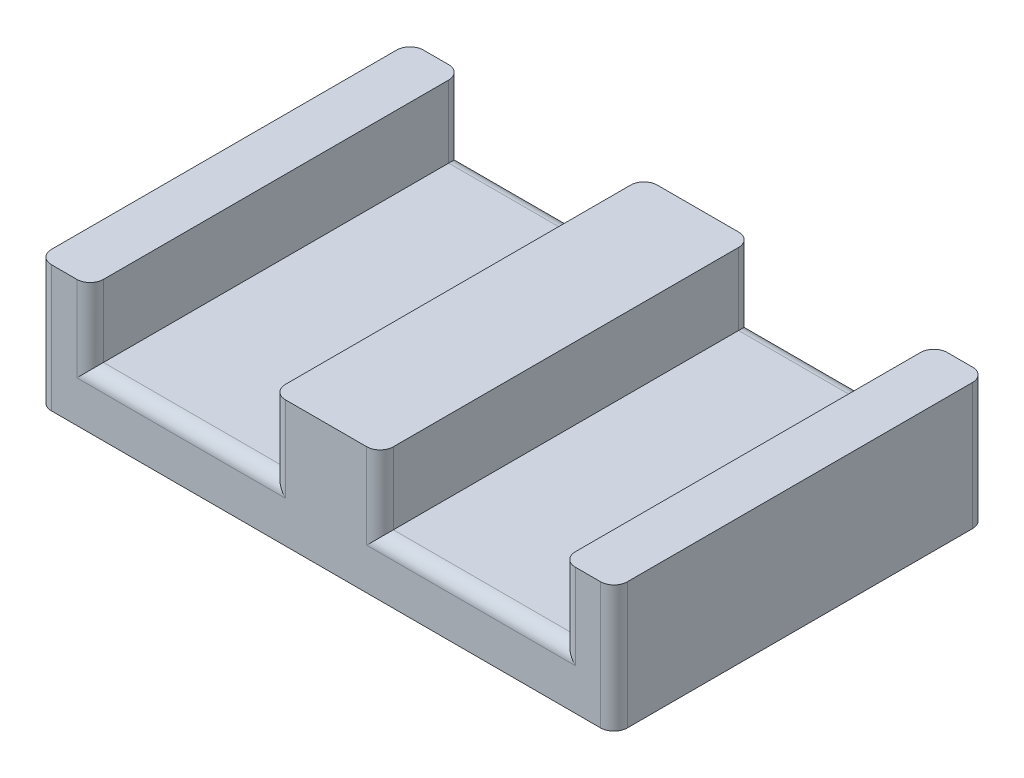
ISO-10303-21;
HEADER;
FILE_DESCRIPTION(('STEP AP214'),'2;1');
FILE_NAME('part.step','',(''),(''),'','','');
FILE_SCHEMA(('AUTOMOTIVE_DESIGN { 1 0 10303 214 1 1 1 1 }'));
ENDSEC;
DATA;
#1=APPLICATION_CONTEXT('core data for automotive mechanical design processes');
#2=APPLICATION_PROTOCOL_DEFINITION('international standard','automotive_design',2000,#1);
#3=PRODUCT_CONTEXT('',#1,'mechanical');
#4=PRODUCT('Part','Part','',(#3));
#5=PRODUCT_RELATED_PRODUCT_CATEGORY('part','',(#4));
#6=PRODUCT_DEFINITION_FORMATION('','',#4);
#7=PRODUCT_DEFINITION_CONTEXT('part definition',#1,'design');
#8=PRODUCT_DEFINITION('design','',#6,#7);
#9=PRODUCT_DEFINITION_SHAPE('','',#8);
#10=(LENGTH_UNIT() NAMED_UNIT(*) SI_UNIT(.MILLI.,.METRE.));
#11=(NAMED_UNIT(*) PLANE_ANGLE_UNIT() SI_UNIT($,.RADIAN.));
#12=(NAMED_UNIT(*) SI_UNIT($,.STERADIAN.) SOLID_ANGLE_UNIT());
#13=UNCERTAINTY_MEASURE_WITH_UNIT(LENGTH_MEASURE(1.E-05),#10,'distance_accuracy_value','');
#14=(GEOMETRIC_REPRESENTATION_CONTEXT(3) GLOBAL_UNCERTAINTY_ASSIGNED_CONTEXT((#13)) GLOBAL_UNIT_ASSIGNED_CONTEXT((#10,
#11,#12)) REPRESENTATION_CONTEXT('',''));
#15=CARTESIAN_POINT('',(0.,0.,0.));
#16=DIRECTION('',(0.,0.,1.));
#17=DIRECTION('',(1.,0.,0.));
#18=AXIS2_PLACEMENT_3D('',#15,#16,#17);
#19=CARTESIAN_POINT('',(0.,4.1,0.));
#20=DIRECTION('',(0.,-1.,0.));
#21=DIRECTION('',(0.,0.,-1.));
#22=AXIS2_PLACEMENT_3D('',#19,#20,#21);
#23=PLANE('',#22);
#24=DIRECTION('',(0.,0.,1.));
#25=VECTOR('',#24,1.);
#26=CARTESIAN_POINT('',(17.7,4.1,13.95));
#27=LINE('',#26,#25);
#28=CARTESIAN_POINT('',(17.7,4.1,-12.95));
#29=VERTEX_POINT('',#28);
#30=CARTESIAN_POINT('',(17.7,4.1,12.95));
#31=VERTEX_POINT('',#30);
#32=EDGE_CURVE('E328',#29,#31,#27,.T.);
#33=ORIENTED_EDGE('',*,*,#32,.F.);
#34=DIRECTION('',(-1.,0.,0.));
#35=VECTOR('',#34,1.);
#36=CARTESIAN_POINT('',(0.,4.1,-12.95));
#37=LINE('',#36,#35);
#38=CARTESIAN_POINT('',(4.05,4.1,-12.95));
#39=VERTEX_POINT('',#38);
#40=EDGE_CURVE('E295',#29,#39,#37,.T.);
#41=ORIENTED_EDGE('',*,*,#40,.T.);
#42=DIRECTION('',(0.,0.,-1.));
#43=VECTOR('',#42,1.);
#44=CARTESIAN_POINT('',(4.05,4.1,-13.95));
#45=LINE('',#44,#43);
#46=CARTESIAN_POINT('',(4.05,4.1,12.95));
#47=VERTEX_POINT('',#46);
#48=EDGE_CURVE('E368',#47,#39,#45,.T.);
#49=ORIENTED_EDGE('',*,*,#48,.F.);
#50=DIRECTION('',(1.,0.,0.));
#51=VECTOR('',#50,1.);
#52=CARTESIAN_POINT('',(0.,4.1,12.95));
#53=LINE('',#52,#51);
#54=EDGE_CURVE('E293',#47,#31,#53,.T.);
#55=ORIENTED_EDGE('',*,*,#54,.T.);
#56=EDGE_LOOP('',(#33,#41,#49,#55));
#57=FACE_BOUND('',#56,.T.);
#58=ADVANCED_FACE('F37',(#57),#23,.F.);
#59=DIRECTION('',(0.,0.,1.));
#60=VECTOR('',#59,1.);
#61=CARTESIAN_POINT('',(-4.05,4.1,-13.95));
#62=LINE('',#61,#60);
#63=CARTESIAN_POINT('',(-4.05,4.1,-12.95));
#64=VERTEX_POINT('',#63);
#65=CARTESIAN_POINT('',(-4.05,4.1,12.95));
#66=VERTEX_POINT('',#65);
#67=EDGE_CURVE('E375',#64,#66,#62,.T.);
#68=ORIENTED_EDGE('',*,*,#67,.F.);
#69=DIRECTION('',(-1.,0.,0.));
#70=VECTOR('',#69,1.);
#71=CARTESIAN_POINT('',(0.,4.1,-12.95));
#72=LINE('',#71,#70);
#73=CARTESIAN_POINT('',(-17.7,4.1,-12.95));
#74=VERTEX_POINT('',#73);
#75=EDGE_CURVE('E300',#64,#74,#72,.T.);
#76=ORIENTED_EDGE('',*,*,#75,.T.);
#77=DIRECTION('',(0.,0.,-1.));
#78=VECTOR('',#77,1.);
#79=CARTESIAN_POINT('',(-17.7,4.1,13.95));
#80=LINE('',#79,#78);
#81=CARTESIAN_POINT('',(-17.7,4.1,12.95));
#82=VERTEX_POINT('',#81);
#83=EDGE_CURVE('E362',#82,#74,#80,.T.);
#84=ORIENTED_EDGE('',*,*,#83,.F.);
#85=DIRECTION('',(1.,0.,0.));
#86=VECTOR('',#85,1.);
#87=CARTESIAN_POINT('',(0.,4.1,12.95));
#88=LINE('',#87,#86);
#89=EDGE_CURVE('E298',#82,#66,#88,.T.);
#90=ORIENTED_EDGE('',*,*,#89,.T.);
#91=EDGE_LOOP('',(#68,#76,#84,#90));
#92=FACE_BOUND('',#91,.T.);
#93=ADVANCED_FACE('F413',(#92),#23,.F.);
#94=CARTESIAN_POINT('',(21.6,4.1,13.95));
#95=DIRECTION('',(-1.,0.,0.));
#96=DIRECTION('',(0.,0.,1.));
#97=AXIS2_PLACEMENT_3D('',#94,#95,#96);
#98=PLANE('',#97);
#99=DIRECTION('',(0.,0.,-1.));
#100=VECTOR('',#99,1.);
#101=CARTESIAN_POINT('',(21.6,9.5,13.95));
#102=LINE('',#101,#100);
#103=CARTESIAN_POINT('',(21.6,9.5,12.95));
#104=VERTEX_POINT('',#103);
#105=CARTESIAN_POINT('',(21.6,9.5,-12.95));
#106=VERTEX_POINT('',#105);
#107=EDGE_CURVE('E468',#104,#106,#102,.T.);
#108=ORIENTED_EDGE('',*,*,#107,.F.);
#109=DIRECTION('',(0.,-1.,0.));
#110=VECTOR('',#109,1.);
#111=CARTESIAN_POINT('',(21.6,4.1,12.95));
#112=LINE('',#111,#110);
#113=CARTESIAN_POINT('',(21.6,0.,12.95));
#114=VERTEX_POINT('',#113);
#115=EDGE_CURVE('E282',#104,#114,#112,.T.);
#116=ORIENTED_EDGE('',*,*,#115,.T.);
#117=DIRECTION('',(0.,0.,-1.));
#118=VECTOR('',#117,1.);
#119=CARTESIAN_POINT('',(21.6,0.,13.95));
#120=LINE('',#119,#118);
#121=CARTESIAN_POINT('',(21.6,0.,-12.95));
#122=VERTEX_POINT('',#121);
#123=EDGE_CURVE('E383',#114,#122,#120,.T.);
#124=ORIENTED_EDGE('',*,*,#123,.T.);
#125=DIRECTION('',(0.,-1.,0.));
#126=VECTOR('',#125,1.);
#127=CARTESIAN_POINT('',(21.6,4.1,-12.95));
#128=LINE('',#127,#126);
#129=EDGE_CURVE('E280',#122,#106,#128,.F.);
#130=ORIENTED_EDGE('',*,*,#129,.T.);
#131=EDGE_LOOP('',(#108,#116,#124,#130));
#132=FACE_BOUND('',#131,.T.);
#133=ADVANCED_FACE('F410',(#132),#98,.F.);
#134=CARTESIAN_POINT('',(-21.6,4.1,-13.95));
#135=DIRECTION('',(0.,0.,1.));
#136=DIRECTION('',(1.,0.,0.));
#137=AXIS2_PLACEMENT_3D('',#134,#135,#136);
#138=PLANE('',#137);
#139=DIRECTION('',(-1.,0.,0.));
#140=VECTOR('',#139,1.);
#141=CARTESIAN_POINT('',(-21.6,0.,-13.95));
#142=LINE('',#141,#140);
#143=CARTESIAN_POINT('',(20.6,0.,-13.95));
#144=VERTEX_POINT('',#143);
#145=CARTESIAN_POINT('',(-20.6,0.,-13.95));
#146=VERTEX_POINT('',#145);
#147=EDGE_CURVE('E233',#144,#146,#142,.T.);
#148=ORIENTED_EDGE('',*,*,#147,.T.);
#149=DIRECTION('',(0.,-1.,0.));
#150=VECTOR('',#149,1.);
#151=CARTESIAN_POINT('',(-20.6,4.1,-13.95));
#152=LINE('',#151,#150);
#153=CARTESIAN_POINT('',(-20.6,9.5,-13.95));
#154=VERTEX_POINT('',#153);
#155=EDGE_CURVE('E278',#146,#154,#152,.F.);
#156=ORIENTED_EDGE('',*,*,#155,.T.);
#157=DIRECTION('',(-1.,0.,0.));
#158=VECTOR('',#157,1.);
#159=CARTESIAN_POINT('',(-21.6,9.5,-13.95));
#160=LINE('',#159,#158);
#161=CARTESIAN_POINT('',(-18.7,9.5,-13.95));
#162=VERTEX_POINT('',#161);
#163=EDGE_CURVE('E360',#162,#154,#160,.T.);
#164=ORIENTED_EDGE('',*,*,#163,.F.);
#165=DIRECTION('',(0.,-1.,0.));
#166=VECTOR('',#165,1.);
#167=CARTESIAN_POINT('',(-18.7,4.1,-13.95));
#168=LINE('',#167,#166);
#169=CARTESIAN_POINT('',(-18.7,3.1,-13.95));
#170=VERTEX_POINT('',#169);
#171=EDGE_CURVE('E273',#162,#170,#168,.T.);
#172=ORIENTED_EDGE('',*,*,#171,.T.);
#173=DIRECTION('',(-1.,0.,0.));
#174=VECTOR('',#173,1.);
#175=CARTESIAN_POINT('',(-21.6,3.1,-13.95));
#176=LINE('',#175,#174);
#177=CARTESIAN_POINT('',(-3.05,3.1,-13.95));
#178=VERTEX_POINT('',#177);
#179=EDGE_CURVE('E271',#170,#178,#176,.F.);
#180=ORIENTED_EDGE('',*,*,#179,.T.);
#181=DIRECTION('',(0.,-1.,0.));
#182=VECTOR('',#181,1.);
#183=CARTESIAN_POINT('',(-3.05,4.1,-13.95));
#184=LINE('',#183,#182);
#185=CARTESIAN_POINT('',(-3.05,9.5,-13.95));
#186=VERTEX_POINT('',#185);
#187=EDGE_CURVE('E269',#178,#186,#184,.F.);
#188=ORIENTED_EDGE('',*,*,#187,.T.);
#189=DIRECTION('',(-1.,0.,0.));
#190=VECTOR('',#189,1.);
#191=CARTESIAN_POINT('',(-4.05,9.5,-13.95));
#192=LINE('',#191,#190);
#193=CARTESIAN_POINT('',(3.05,9.5,-13.95));
#194=VERTEX_POINT('',#193);
#195=EDGE_CURVE('E374',#194,#186,#192,.T.);
#196=ORIENTED_EDGE('',*,*,#195,.F.);
#197=DIRECTION('',(0.,-1.,0.));
#198=VECTOR('',#197,1.);
#199=CARTESIAN_POINT('',(3.05,4.1,-13.95));
#200=LINE('',#199,#198);
#201=CARTESIAN_POINT('',(3.05,3.1,-13.95));
#202=VERTEX_POINT('',#201);
#203=EDGE_CURVE('E267',#194,#202,#200,.T.);
#204=ORIENTED_EDGE('',*,*,#203,.T.);
#205=DIRECTION('',(-1.,0.,0.));
#206=VECTOR('',#205,1.);
#207=CARTESIAN_POINT('',(-21.6,3.1,-13.95));
#208=LINE('',#207,#206);
#209=CARTESIAN_POINT('',(18.7,3.1,-13.95));
#210=VERTEX_POINT('',#209);
#211=EDGE_CURVE('E265',#202,#210,#208,.F.);
#212=ORIENTED_EDGE('',*,*,#211,.T.);
#213=DIRECTION('',(0.,-1.,0.));
#214=VECTOR('',#213,1.);
#215=CARTESIAN_POINT('',(18.7,4.1,-13.95));
#216=LINE('',#215,#214);
#217=CARTESIAN_POINT('',(18.7,9.5,-13.95));
#218=VERTEX_POINT('',#217);
#219=EDGE_CURVE('E263',#210,#218,#216,.F.);
#220=ORIENTED_EDGE('',*,*,#219,.T.);
#221=DIRECTION('',(-1.,0.,0.));
#222=VECTOR('',#221,1.);
#223=CARTESIAN_POINT('',(21.6,9.5,-13.95));
#224=LINE('',#223,#222);
#225=CARTESIAN_POINT('',(20.6,9.5,-13.95));
#226=VERTEX_POINT('',#225);
#227=EDGE_CURVE('E465',#226,#218,#224,.T.);
#228=ORIENTED_EDGE('',*,*,#227,.F.);
#229=DIRECTION('',(0.,-1.,0.));
#230=VECTOR('',#229,1.);
#231=CARTESIAN_POINT('',(20.6,4.1,-13.95));
#232=LINE('',#231,#230);
#233=EDGE_CURVE('E275',#226,#144,#232,.T.);
#234=ORIENTED_EDGE('',*,*,#233,.T.);
#235=EDGE_LOOP('',(#148,#156,#164,#172,#180,#188,#196,#204,#212,#220,#228,#234));
#236=FACE_BOUND('',#235,.T.);
#237=ADVANCED_FACE('F392',(#236),#138,.F.);
#238=CARTESIAN_POINT('',(-21.6,4.1,13.95));
#239=DIRECTION('',(1.,0.,0.));
#240=DIRECTION('',(0.,0.,-1.));
#241=AXIS2_PLACEMENT_3D('',#238,#239,#240);
#242=PLANE('',#241);
#243=DIRECTION('',(0.,0.,1.));
#244=VECTOR('',#243,1.);
#245=CARTESIAN_POINT('',(-21.6,0.,13.95));
#246=LINE('',#245,#244);
#247=CARTESIAN_POINT('',(-21.6,0.,-12.95));
#248=VERTEX_POINT('',#247);
#249=CARTESIAN_POINT('',(-21.6,0.,12.95));
#250=VERTEX_POINT('',#249);
#251=EDGE_CURVE('E229',#248,#250,#246,.T.);
#252=ORIENTED_EDGE('',*,*,#251,.T.);
#253=DIRECTION('',(0.,-1.,0.));
#254=VECTOR('',#253,1.);
#255=CARTESIAN_POINT('',(-21.6,4.1,12.95));
#256=LINE('',#255,#254);
#257=CARTESIAN_POINT('',(-21.6,9.5,12.95));
#258=VERTEX_POINT('',#257);
#259=EDGE_CURVE('E206',#250,#258,#256,.F.);
#260=ORIENTED_EDGE('',*,*,#259,.T.);
#261=DIRECTION('',(0.,0.,1.));
#262=VECTOR('',#261,1.);
#263=CARTESIAN_POINT('',(-21.6,9.5,13.95));
#264=LINE('',#263,#262);
#265=CARTESIAN_POINT('',(-21.6,9.5,-12.95));
#266=VERTEX_POINT('',#265);
#267=EDGE_CURVE('E358',#266,#258,#264,.T.);
#268=ORIENTED_EDGE('',*,*,#267,.F.);
#269=DIRECTION('',(0.,-1.,0.));
#270=VECTOR('',#269,1.);
#271=CARTESIAN_POINT('',(-21.6,4.1,-12.95));
#272=LINE('',#271,#270);
#273=EDGE_CURVE('E211',#266,#248,#272,.T.);
#274=ORIENTED_EDGE('',*,*,#273,.T.);
#275=EDGE_LOOP('',(#252,#260,#268,#274));
#276=FACE_BOUND('',#275,.T.);
#277=ADVANCED_FACE('F402',(#276),#242,.F.);
#278=CARTESIAN_POINT('',(-21.6,4.1,13.95));
#279=DIRECTION('',(0.,0.,-1.));
#280=DIRECTION('',(-1.,0.,0.));
#281=AXIS2_PLACEMENT_3D('',#278,#279,#280);
#282=PLANE('',#281);
#283=DIRECTION('',(1.,0.,0.));
#284=VECTOR('',#283,1.);
#285=CARTESIAN_POINT('',(-21.6,9.5,13.95));
#286=LINE('',#285,#284);
#287=CARTESIAN_POINT('',(-20.6,9.5,13.95));
#288=VERTEX_POINT('',#287);
#289=CARTESIAN_POINT('',(-18.7,9.5,13.95));
#290=VERTEX_POINT('',#289);
#291=EDGE_CURVE('E221',#288,#290,#286,.T.);
#292=ORIENTED_EDGE('',*,*,#291,.F.);
#293=DIRECTION('',(0.,-1.,0.));
#294=VECTOR('',#293,1.);
#295=CARTESIAN_POINT('',(-20.6,4.1,13.95));
#296=LINE('',#295,#294);
#297=CARTESIAN_POINT('',(-20.6,0.,13.95));
#298=VERTEX_POINT('',#297);
#299=EDGE_CURVE('E205',#288,#298,#296,.T.);
#300=ORIENTED_EDGE('',*,*,#299,.T.);
#301=DIRECTION('',(1.,0.,0.));
#302=VECTOR('',#301,1.);
#303=CARTESIAN_POINT('',(-21.6,0.,13.95));
#304=LINE('',#303,#302);
#305=CARTESIAN_POINT('',(20.6,0.,13.95));
#306=VERTEX_POINT('',#305);
#307=EDGE_CURVE('E218',#298,#306,#304,.T.);
#308=ORIENTED_EDGE('',*,*,#307,.T.);
#309=DIRECTION('',(0.,-1.,0.));
#310=VECTOR('',#309,1.);
#311=CARTESIAN_POINT('',(20.6,4.1,13.95));
#312=LINE('',#311,#310);
#313=CARTESIAN_POINT('',(20.6,9.5,13.95));
#314=VERTEX_POINT('',#313);
#315=EDGE_CURVE('E223',#306,#314,#312,.F.);
#316=ORIENTED_EDGE('',*,*,#315,.T.);
#317=DIRECTION('',(1.,0.,0.));
#318=VECTOR('',#317,1.);
#319=CARTESIAN_POINT('',(21.6,9.5,13.95));
#320=LINE('',#319,#318);
#321=CARTESIAN_POINT('',(18.7,9.5,13.95));
#322=VERTEX_POINT('',#321);
#323=EDGE_CURVE('E371',#322,#314,#320,.T.);
#324=ORIENTED_EDGE('',*,*,#323,.F.);
#325=DIRECTION('',(0.,-1.,0.));
#326=VECTOR('',#325,1.);
#327=CARTESIAN_POINT('',(18.7,4.1,13.95));
#328=LINE('',#327,#326);
#329=CARTESIAN_POINT('',(18.7,3.1,13.95));
#330=VERTEX_POINT('',#329);
#331=EDGE_CURVE('E245',#322,#330,#328,.T.);
#332=ORIENTED_EDGE('',*,*,#331,.T.);
#333=DIRECTION('',(1.,0.,0.));
#334=VECTOR('',#333,1.);
#335=CARTESIAN_POINT('',(-21.6,3.1,13.95));
#336=LINE('',#335,#334);
#337=CARTESIAN_POINT('',(3.05,3.1,13.95));
#338=VERTEX_POINT('',#337);
#339=EDGE_CURVE('E243',#330,#338,#336,.F.);
#340=ORIENTED_EDGE('',*,*,#339,.T.);
#341=DIRECTION('',(0.,-1.,0.));
#342=VECTOR('',#341,1.);
#343=CARTESIAN_POINT('',(3.05,4.1,13.95));
#344=LINE('',#343,#342);
#345=CARTESIAN_POINT('',(3.05,9.5,13.95));
#346=VERTEX_POINT('',#345);
#347=EDGE_CURVE('E241',#338,#346,#344,.F.);
#348=ORIENTED_EDGE('',*,*,#347,.T.);
#349=DIRECTION('',(1.,0.,0.));
#350=VECTOR('',#349,1.);
#351=CARTESIAN_POINT('',(-4.05,9.5,13.95));
#352=LINE('',#351,#350);
#353=CARTESIAN_POINT('',(-3.05,9.5,13.95));
#354=VERTEX_POINT('',#353);
#355=EDGE_CURVE('E381',#354,#346,#352,.T.);
#356=ORIENTED_EDGE('',*,*,#355,.F.);
#357=DIRECTION('',(0.,-1.,0.));
#358=VECTOR('',#357,1.);
#359=CARTESIAN_POINT('',(-3.05,4.1,13.95));
#360=LINE('',#359,#358);
#361=CARTESIAN_POINT('',(-3.05,3.1,13.95));
#362=VERTEX_POINT('',#361);
#363=EDGE_CURVE('E238',#354,#362,#360,.T.);
#364=ORIENTED_EDGE('',*,*,#363,.T.);
#365=DIRECTION('',(1.,0.,0.));
#366=VECTOR('',#365,1.);
#367=CARTESIAN_POINT('',(-21.6,3.1,13.95));
#368=LINE('',#367,#366);
#369=CARTESIAN_POINT('',(-18.7,3.1,13.95));
#370=VERTEX_POINT('',#369);
#371=EDGE_CURVE('E231',#362,#370,#368,.F.);
#372=ORIENTED_EDGE('',*,*,#371,.T.);
#373=DIRECTION('',(0.,-1.,0.));
#374=VECTOR('',#373,1.);
#375=CARTESIAN_POINT('',(-18.7,4.1,13.95));
#376=LINE('',#375,#374);
#377=EDGE_CURVE('E228',#370,#290,#376,.F.);
#378=ORIENTED_EDGE('',*,*,#377,.T.);
#379=EDGE_LOOP('',(#292,#300,#308,#316,#324,#332,#340,#348,#356,#364,#372,#378));
#380=FACE_BOUND('',#379,.T.);
#381=ADVANCED_FACE('F217',(#380),#282,.F.);
#382=CARTESIAN_POINT('',(0.,0.,0.));
#383=DIRECTION('',(0.,-1.,0.));
#384=DIRECTION('',(0.,0.,-1.));
#385=AXIS2_PLACEMENT_3D('',#382,#383,#384);
#386=PLANE('',#385);
#387=ORIENTED_EDGE('',*,*,#307,.F.);
#388=CARTESIAN_POINT('',(-20.6,0.,12.95));
#389=DIRECTION('',(0.,-1.,0.));
#390=DIRECTION('',(0.,0.,-1.));
#391=AXIS2_PLACEMENT_3D('',#388,#389,#390);
#392=CIRCLE('',#391,1.);
#393=EDGE_CURVE('E201',#298,#250,#392,.T.);
#394=ORIENTED_EDGE('',*,*,#393,.T.);
#395=ORIENTED_EDGE('',*,*,#251,.F.);
#396=CARTESIAN_POINT('',(-20.6,0.,-12.95));
#397=DIRECTION('',(0.,-1.,0.));
#398=DIRECTION('',(0.,0.,-1.));
#399=AXIS2_PLACEMENT_3D('',#396,#397,#398);
#400=CIRCLE('',#399,1.);
#401=EDGE_CURVE('E212',#248,#146,#400,.T.);
#402=ORIENTED_EDGE('',*,*,#401,.T.);
#403=ORIENTED_EDGE('',*,*,#147,.F.);
#404=CARTESIAN_POINT('',(20.6,0.,-12.95));
#405=DIRECTION('',(0.,-1.,0.));
#406=DIRECTION('',(0.,0.,-1.));
#407=AXIS2_PLACEMENT_3D('',#404,#405,#406);
#408=CIRCLE('',#407,1.);
#409=EDGE_CURVE('E222',#144,#122,#408,.T.);
#410=ORIENTED_EDGE('',*,*,#409,.T.);
#411=ORIENTED_EDGE('',*,*,#123,.F.);
#412=CARTESIAN_POINT('',(20.6,0.,12.95));
#413=DIRECTION('',(0.,-1.,0.));
#414=DIRECTION('',(0.,0.,-1.));
#415=AXIS2_PLACEMENT_3D('',#412,#413,#414);
#416=CIRCLE('',#415,1.);
#417=EDGE_CURVE('E227',#114,#306,#416,.T.);
#418=ORIENTED_EDGE('',*,*,#417,.T.);
#419=EDGE_LOOP('',(#387,#394,#395,#402,#403,#410,#411,#418));
#420=FACE_BOUND('',#419,.T.);
#421=ADVANCED_FACE('F225',(#420),#386,.T.);
#422=CARTESIAN_POINT('',(4.05,9.5,-13.95));
#423=DIRECTION('',(-1.,0.,0.));
#424=DIRECTION('',(0.,0.,1.));
#425=AXIS2_PLACEMENT_3D('',#422,#423,#424);
#426=PLANE('',#425);
#427=ORIENTED_EDGE('',*,*,#48,.T.);
#428=DIRECTION('',(0.,-1.,0.));
#429=VECTOR('',#428,1.);
#430=CARTESIAN_POINT('',(4.05,9.5,-12.95));
#431=LINE('',#430,#429);
#432=CARTESIAN_POINT('',(4.05,9.5,-12.95));
#433=VERTEX_POINT('',#432);
#434=EDGE_CURVE('E54',#39,#433,#431,.F.);
#435=ORIENTED_EDGE('',*,*,#434,.T.);
#436=DIRECTION('',(0.,0.,-1.));
#437=VECTOR('',#436,1.);
#438=CARTESIAN_POINT('',(4.05,9.5,-13.95));
#439=LINE('',#438,#437);
#440=CARTESIAN_POINT('',(4.05,9.5,12.95));
#441=VERTEX_POINT('',#440);
#442=EDGE_CURVE('E372',#441,#433,#439,.T.);
#443=ORIENTED_EDGE('',*,*,#442,.F.);
#444=DIRECTION('',(0.,-1.,0.));
#445=VECTOR('',#444,1.);
#446=CARTESIAN_POINT('',(4.05,9.5,12.95));
#447=LINE('',#446,#445);
#448=EDGE_CURVE('E318',#441,#47,#447,.T.);
#449=ORIENTED_EDGE('',*,*,#448,.T.);
#450=EDGE_LOOP('',(#427,#435,#443,#449));
#451=FACE_BOUND('',#450,.T.);
#452=ADVANCED_FACE('F423',(#451),#426,.F.);
#453=CARTESIAN_POINT('',(-4.05,9.5,-13.95));
#454=DIRECTION('',(1.,0.,0.));
#455=DIRECTION('',(0.,0.,-1.));
#456=AXIS2_PLACEMENT_3D('',#453,#454,#455);
#457=PLANE('',#456);
#458=DIRECTION('',(0.,0.,1.));
#459=VECTOR('',#458,1.);
#460=CARTESIAN_POINT('',(-4.05,9.5,-13.95));
#461=LINE('',#460,#459);
#462=CARTESIAN_POINT('',(-4.05,9.5,-12.95));
#463=VERTEX_POINT('',#462);
#464=CARTESIAN_POINT('',(-4.05,9.5,12.95));
#465=VERTEX_POINT('',#464);
#466=EDGE_CURVE('E378',#463,#465,#461,.T.);
#467=ORIENTED_EDGE('',*,*,#466,.F.);
#468=DIRECTION('',(0.,-1.,0.));
#469=VECTOR('',#468,1.);
#470=CARTESIAN_POINT('',(-4.05,9.5,-12.95));
#471=LINE('',#470,#469);
#472=EDGE_CURVE('E309',#463,#64,#471,.T.);
#473=ORIENTED_EDGE('',*,*,#472,.T.);
#474=ORIENTED_EDGE('',*,*,#67,.T.);
#475=DIRECTION('',(0.,-1.,0.));
#476=VECTOR('',#475,1.);
#477=CARTESIAN_POINT('',(-4.05,9.5,12.95));
#478=LINE('',#477,#476);
#479=EDGE_CURVE('E307',#66,#465,#478,.F.);
#480=ORIENTED_EDGE('',*,*,#479,.T.);
#481=EDGE_LOOP('',(#467,#473,#474,#480));
#482=FACE_BOUND('',#481,.T.);
#483=ADVANCED_FACE('F429',(#482),#457,.F.);
#484=CARTESIAN_POINT('',(0.,9.5,0.));
#485=DIRECTION('',(0.,1.,0.));
#486=DIRECTION('',(0.,0.,1.));
#487=AXIS2_PLACEMENT_3D('',#484,#485,#486);
#488=PLANE('',#487);
#489=ORIENTED_EDGE('',*,*,#195,.T.);
#490=CARTESIAN_POINT('',(-3.05,9.5,-12.95));
#491=DIRECTION('',(0.,1.,0.));
#492=DIRECTION('',(0.,0.,1.));
#493=AXIS2_PLACEMENT_3D('',#490,#491,#492);
#494=CIRCLE('',#493,1.);
#495=EDGE_CURVE('E316',#186,#463,#494,.T.);
#496=ORIENTED_EDGE('',*,*,#495,.T.);
#497=ORIENTED_EDGE('',*,*,#466,.T.);
#498=CARTESIAN_POINT('',(-3.05,9.5,12.95));
#499=DIRECTION('',(0.,1.,0.));
#500=DIRECTION('',(0.,0.,1.));
#501=AXIS2_PLACEMENT_3D('',#498,#499,#500);
#502=CIRCLE('',#501,1.);
#503=EDGE_CURVE('E311',#465,#354,#502,.T.);
#504=ORIENTED_EDGE('',*,*,#503,.T.);
#505=ORIENTED_EDGE('',*,*,#355,.T.);
#506=CARTESIAN_POINT('',(3.05,9.5,12.95));
#507=DIRECTION('',(0.,1.,0.));
#508=DIRECTION('',(0.,0.,1.));
#509=AXIS2_PLACEMENT_3D('',#506,#507,#508);
#510=CIRCLE('',#509,1.);
#511=EDGE_CURVE('E61',#346,#441,#510,.T.);
#512=ORIENTED_EDGE('',*,*,#511,.T.);
#513=ORIENTED_EDGE('',*,*,#442,.T.);
#514=CARTESIAN_POINT('',(3.05,9.5,-12.95));
#515=DIRECTION('',(0.,1.,0.));
#516=DIRECTION('',(0.,0.,1.));
#517=AXIS2_PLACEMENT_3D('',#514,#515,#516);
#518=CIRCLE('',#517,1.);
#519=EDGE_CURVE('E314',#433,#194,#518,.T.);
#520=ORIENTED_EDGE('',*,*,#519,.T.);
#521=EDGE_LOOP('',(#489,#496,#497,#504,#505,#512,#513,#520));
#522=FACE_BOUND('',#521,.T.);
#523=ADVANCED_FACE('F433',(#522),#488,.T.);
#524=CARTESIAN_POINT('',(-17.7,9.5,13.95));
#525=DIRECTION('',(-1.,0.,0.));
#526=DIRECTION('',(0.,0.,1.));
#527=AXIS2_PLACEMENT_3D('',#524,#525,#526);
#528=PLANE('',#527);
#529=ORIENTED_EDGE('',*,*,#83,.T.);
#530=DIRECTION('',(0.,-1.,0.));
#531=VECTOR('',#530,1.);
#532=CARTESIAN_POINT('',(-17.7,9.5,-12.95));
#533=LINE('',#532,#531);
#534=CARTESIAN_POINT('',(-17.7,9.5,-12.95));
#535=VERTEX_POINT('',#534);
#536=EDGE_CURVE('E305',#74,#535,#533,.F.);
#537=ORIENTED_EDGE('',*,*,#536,.T.);
#538=DIRECTION('',(0.,0.,-1.));
#539=VECTOR('',#538,1.);
#540=CARTESIAN_POINT('',(-17.7,9.5,13.95));
#541=LINE('',#540,#539);
#542=CARTESIAN_POINT('',(-17.7,9.5,12.95));
#543=VERTEX_POINT('',#542);
#544=EDGE_CURVE('E357',#543,#535,#541,.T.);
#545=ORIENTED_EDGE('',*,*,#544,.F.);
#546=DIRECTION('',(0.,-1.,0.));
#547=VECTOR('',#546,1.);
#548=CARTESIAN_POINT('',(-17.7,9.5,12.95));
#549=LINE('',#548,#547);
#550=EDGE_CURVE('E303',#543,#82,#549,.T.);
#551=ORIENTED_EDGE('',*,*,#550,.T.);
#552=EDGE_LOOP('',(#529,#537,#545,#551));
#553=FACE_BOUND('',#552,.T.);
#554=ADVANCED_FACE('F505',(#553),#528,.F.);
#555=CARTESIAN_POINT('',(0.,9.5,0.));
#556=DIRECTION('',(0.,-1.,0.));
#557=DIRECTION('',(0.,0.,-1.));
#558=AXIS2_PLACEMENT_3D('',#555,#556,#557);
#559=PLANE('',#558);
#560=ORIENTED_EDGE('',*,*,#267,.T.);
#561=CARTESIAN_POINT('',(-20.6,9.5,12.95));
#562=DIRECTION('',(0.,-1.,0.));
#563=DIRECTION('',(0.,0.,-1.));
#564=AXIS2_PLACEMENT_3D('',#561,#562,#563);
#565=CIRCLE('',#564,1.);
#566=EDGE_CURVE('E261',#258,#288,#565,.F.);
#567=ORIENTED_EDGE('',*,*,#566,.T.);
#568=ORIENTED_EDGE('',*,*,#291,.T.);
#569=CARTESIAN_POINT('',(-18.7,9.5,12.95));
#570=DIRECTION('',(0.,-1.,0.));
#571=DIRECTION('',(0.,0.,-1.));
#572=AXIS2_PLACEMENT_3D('',#569,#570,#571);
#573=CIRCLE('',#572,1.);
#574=EDGE_CURVE('E255',#290,#543,#573,.F.);
#575=ORIENTED_EDGE('',*,*,#574,.T.);
#576=ORIENTED_EDGE('',*,*,#544,.T.);
#577=CARTESIAN_POINT('',(-18.7,9.5,-12.95));
#578=DIRECTION('',(0.,-1.,0.));
#579=DIRECTION('',(0.,0.,-1.));
#580=AXIS2_PLACEMENT_3D('',#577,#578,#579);
#581=CIRCLE('',#580,1.);
#582=EDGE_CURVE('E257',#535,#162,#581,.F.);
#583=ORIENTED_EDGE('',*,*,#582,.T.);
#584=ORIENTED_EDGE('',*,*,#163,.T.);
#585=CARTESIAN_POINT('',(-20.6,9.5,-12.95));
#586=DIRECTION('',(0.,-1.,0.));
#587=DIRECTION('',(0.,0.,-1.));
#588=AXIS2_PLACEMENT_3D('',#585,#586,#587);
#589=CIRCLE('',#588,1.);
#590=EDGE_CURVE('E259',#154,#266,#589,.F.);
#591=ORIENTED_EDGE('',*,*,#590,.T.);
#592=EDGE_LOOP('',(#560,#567,#568,#575,#576,#583,#584,#591));
#593=FACE_BOUND('',#592,.T.);
#594=ADVANCED_FACE('F354',(#593),#559,.F.);
#595=CARTESIAN_POINT('',(17.7,9.5,13.95));
#596=DIRECTION('',(1.,0.,0.));
#597=DIRECTION('',(0.,0.,-1.));
#598=AXIS2_PLACEMENT_3D('',#595,#596,#597);
#599=PLANE('',#598);
#600=DIRECTION('',(0.,0.,1.));
#601=VECTOR('',#600,1.);
#602=CARTESIAN_POINT('',(17.7,9.5,13.95));
#603=LINE('',#602,#601);
#604=CARTESIAN_POINT('',(17.7,9.5,-12.95));
#605=VERTEX_POINT('',#604);
#606=CARTESIAN_POINT('',(17.7,9.5,12.95));
#607=VERTEX_POINT('',#606);
#608=EDGE_CURVE('E457',#605,#607,#603,.T.);
#609=ORIENTED_EDGE('',*,*,#608,.F.);
#610=DIRECTION('',(0.,-1.,0.));
#611=VECTOR('',#610,1.);
#612=CARTESIAN_POINT('',(17.7,9.5,-12.95));
#613=LINE('',#612,#611);
#614=EDGE_CURVE('E11',#605,#29,#613,.T.);
#615=ORIENTED_EDGE('',*,*,#614,.T.);
#616=ORIENTED_EDGE('',*,*,#32,.T.);
#617=DIRECTION('',(0.,-1.,0.));
#618=VECTOR('',#617,1.);
#619=CARTESIAN_POINT('',(17.7,9.5,12.95));
#620=LINE('',#619,#618);
#621=EDGE_CURVE('E46',#31,#607,#620,.F.);
#622=ORIENTED_EDGE('',*,*,#621,.T.);
#623=EDGE_LOOP('',(#609,#615,#616,#622));
#624=FACE_BOUND('',#623,.T.);
#625=ADVANCED_FACE('F456',(#624),#599,.F.);
#626=CARTESIAN_POINT('',(0.,9.5,0.));
#627=DIRECTION('',(0.,1.,0.));
#628=DIRECTION('',(0.,0.,1.));
#629=AXIS2_PLACEMENT_3D('',#626,#627,#628);
#630=PLANE('',#629);
#631=ORIENTED_EDGE('',*,*,#323,.T.);
#632=CARTESIAN_POINT('',(20.6,9.5,12.95));
#633=DIRECTION('',(0.,1.,0.));
#634=DIRECTION('',(0.,0.,1.));
#635=AXIS2_PLACEMENT_3D('',#632,#633,#634);
#636=CIRCLE('',#635,1.);
#637=EDGE_CURVE('E291',#314,#104,#636,.T.);
#638=ORIENTED_EDGE('',*,*,#637,.T.);
#639=ORIENTED_EDGE('',*,*,#107,.T.);
#640=CARTESIAN_POINT('',(20.6,9.5,-12.95));
#641=DIRECTION('',(0.,1.,0.));
#642=DIRECTION('',(0.,0.,1.));
#643=AXIS2_PLACEMENT_3D('',#640,#641,#642);
#644=CIRCLE('',#643,1.);
#645=EDGE_CURVE('E289',#106,#226,#644,.T.);
#646=ORIENTED_EDGE('',*,*,#645,.T.);
#647=ORIENTED_EDGE('',*,*,#227,.T.);
#648=CARTESIAN_POINT('',(18.7,9.5,-12.95));
#649=DIRECTION('',(0.,1.,0.));
#650=DIRECTION('',(0.,0.,1.));
#651=AXIS2_PLACEMENT_3D('',#648,#649,#650);
#652=CIRCLE('',#651,1.);
#653=EDGE_CURVE('E287',#218,#605,#652,.T.);
#654=ORIENTED_EDGE('',*,*,#653,.T.);
#655=ORIENTED_EDGE('',*,*,#608,.T.);
#656=CARTESIAN_POINT('',(18.7,9.5,12.95));
#657=DIRECTION('',(0.,1.,0.));
#658=DIRECTION('',(0.,0.,1.));
#659=AXIS2_PLACEMENT_3D('',#656,#657,#658);
#660=CIRCLE('',#659,1.);
#661=EDGE_CURVE('E285',#607,#322,#660,.T.);
#662=ORIENTED_EDGE('',*,*,#661,.T.);
#663=EDGE_LOOP('',(#631,#638,#639,#646,#647,#654,#655,#662));
#664=FACE_BOUND('',#663,.T.);
#665=ADVANCED_FACE('F461',(#664),#630,.T.);
#666=CARTESIAN_POINT('',(-20.6,4.1,12.95));
#667=DIRECTION('',(0.,-1.,0.));
#668=DIRECTION('',(0.,0.,-1.));
#669=AXIS2_PLACEMENT_3D('',#666,#667,#668);
#670=CYLINDRICAL_SURFACE('',#669,1.);
#671=ORIENTED_EDGE('',*,*,#566,.F.);
#672=ORIENTED_EDGE('',*,*,#259,.F.);
#673=ORIENTED_EDGE('',*,*,#393,.F.);
#674=ORIENTED_EDGE('',*,*,#299,.F.);
#675=EDGE_LOOP('',(#671,#672,#673,#674));
#676=FACE_BOUND('',#675,.T.);
#677=ADVANCED_FACE('F204',(#676),#670,.T.);
#678=CARTESIAN_POINT('',(-20.6,4.1,-12.95));
#679=DIRECTION('',(0.,-1.,0.));
#680=DIRECTION('',(0.,0.,-1.));
#681=AXIS2_PLACEMENT_3D('',#678,#679,#680);
#682=CYLINDRICAL_SURFACE('',#681,1.);
#683=ORIENTED_EDGE('',*,*,#590,.F.);
#684=ORIENTED_EDGE('',*,*,#155,.F.);
#685=ORIENTED_EDGE('',*,*,#401,.F.);
#686=ORIENTED_EDGE('',*,*,#273,.F.);
#687=EDGE_LOOP('',(#683,#684,#685,#686));
#688=FACE_BOUND('',#687,.T.);
#689=ADVANCED_FACE('F398',(#688),#682,.T.);
#690=CARTESIAN_POINT('',(20.6,4.1,12.95));
#691=DIRECTION('',(0.,-1.,0.));
#692=DIRECTION('',(0.,0.,-1.));
#693=AXIS2_PLACEMENT_3D('',#690,#691,#692);
#694=CYLINDRICAL_SURFACE('',#693,1.);
#695=ORIENTED_EDGE('',*,*,#637,.F.);
#696=ORIENTED_EDGE('',*,*,#315,.F.);
#697=ORIENTED_EDGE('',*,*,#417,.F.);
#698=ORIENTED_EDGE('',*,*,#115,.F.);
#699=EDGE_LOOP('',(#695,#696,#697,#698));
#700=FACE_BOUND('',#699,.T.);
#701=ADVANCED_FACE('F481',(#700),#694,.T.);
#702=CARTESIAN_POINT('',(20.6,4.1,-12.95));
#703=DIRECTION('',(0.,-1.,0.));
#704=DIRECTION('',(0.,0.,-1.));
#705=AXIS2_PLACEMENT_3D('',#702,#703,#704);
#706=CYLINDRICAL_SURFACE('',#705,1.);
#707=ORIENTED_EDGE('',*,*,#645,.F.);
#708=ORIENTED_EDGE('',*,*,#129,.F.);
#709=ORIENTED_EDGE('',*,*,#409,.F.);
#710=ORIENTED_EDGE('',*,*,#233,.F.);
#711=EDGE_LOOP('',(#707,#708,#709,#710));
#712=FACE_BOUND('',#711,.T.);
#713=ADVANCED_FACE('F479',(#712),#706,.T.);
#714=CARTESIAN_POINT('',(18.7,9.5,-12.95));
#715=DIRECTION('',(0.,-1.,0.));
#716=DIRECTION('',(0.,0.,-1.));
#717=AXIS2_PLACEMENT_3D('',#714,#715,#716);
#718=CYLINDRICAL_SURFACE('',#717,1.);
#719=ORIENTED_EDGE('',*,*,#653,.F.);
#720=ORIENTED_EDGE('',*,*,#219,.F.);
#721=CARTESIAN_POINT('',(18.7,3.1,-12.95));
#722=DIRECTION('',(-0.707106781186547,-0.707106781186547,0.));
#723=DIRECTION('',(-0.707106781186547,0.707106781186547,0.));
#724=AXIS2_PLACEMENT_3D('',#721,#722,#723);
#725=ELLIPSE('',#724,1.41421356237309,1.);
#726=EDGE_CURVE('E324',#29,#210,#725,.T.);
#727=ORIENTED_EDGE('',*,*,#726,.F.);
#728=ORIENTED_EDGE('',*,*,#614,.F.);
#729=EDGE_LOOP('',(#719,#720,#727,#728));
#730=FACE_BOUND('',#729,.T.);
#731=ADVANCED_FACE('F518',(#730),#718,.T.);
#732=CARTESIAN_POINT('',(3.05,4.1,-12.95));
#733=DIRECTION('',(0.,-1.,0.));
#734=DIRECTION('',(0.,0.,-1.));
#735=AXIS2_PLACEMENT_3D('',#732,#733,#734);
#736=CYLINDRICAL_SURFACE('',#735,1.);
#737=ORIENTED_EDGE('',*,*,#519,.F.);
#738=ORIENTED_EDGE('',*,*,#434,.F.);
#739=CARTESIAN_POINT('',(3.05,3.1,-12.95));
#740=DIRECTION('',(-0.707106781186547,0.707106781186547,0.));
#741=DIRECTION('',(-0.707106781186547,-0.707106781186547,0.));
#742=AXIS2_PLACEMENT_3D('',#739,#740,#741);
#743=ELLIPSE('',#742,1.41421356237309,1.);
#744=EDGE_CURVE('E322',#202,#39,#743,.F.);
#745=ORIENTED_EDGE('',*,*,#744,.F.);
#746=ORIENTED_EDGE('',*,*,#203,.F.);
#747=EDGE_LOOP('',(#737,#738,#745,#746));
#748=FACE_BOUND('',#747,.T.);
#749=ADVANCED_FACE('F510',(#748),#736,.T.);
#750=CARTESIAN_POINT('',(0.,3.1,-12.95));
#751=DIRECTION('',(-1.,0.,0.));
#752=DIRECTION('',(0.,0.,1.));
#753=AXIS2_PLACEMENT_3D('',#750,#751,#752);
#754=CYLINDRICAL_SURFACE('',#753,1.);
#755=ORIENTED_EDGE('',*,*,#726,.T.);
#756=ORIENTED_EDGE('',*,*,#211,.F.);
#757=ORIENTED_EDGE('',*,*,#744,.T.);
#758=ORIENTED_EDGE('',*,*,#40,.F.);
#759=EDGE_LOOP('',(#755,#756,#757,#758));
#760=FACE_BOUND('',#759,.T.);
#761=ADVANCED_FACE('F515',(#760),#754,.T.);
#762=CARTESIAN_POINT('',(-3.05,9.5,-12.95));
#763=DIRECTION('',(0.,-1.,0.));
#764=DIRECTION('',(0.,0.,-1.));
#765=AXIS2_PLACEMENT_3D('',#762,#763,#764);
#766=CYLINDRICAL_SURFACE('',#765,1.);
#767=ORIENTED_EDGE('',*,*,#495,.F.);
#768=ORIENTED_EDGE('',*,*,#187,.F.);
#769=CARTESIAN_POINT('',(-3.05,3.1,-12.95));
#770=DIRECTION('',(-0.707106781186547,-0.707106781186547,0.));
#771=DIRECTION('',(-0.707106781186547,0.707106781186547,0.));
#772=AXIS2_PLACEMENT_3D('',#769,#770,#771);
#773=ELLIPSE('',#772,1.41421356237309,1.);
#774=EDGE_CURVE('E325',#64,#178,#773,.T.);
#775=ORIENTED_EDGE('',*,*,#774,.F.);
#776=ORIENTED_EDGE('',*,*,#472,.F.);
#777=EDGE_LOOP('',(#767,#768,#775,#776));
#778=FACE_BOUND('',#777,.T.);
#779=ADVANCED_FACE('F494',(#778),#766,.T.);
#780=CARTESIAN_POINT('',(-18.7,4.1,-12.95));
#781=DIRECTION('',(0.,-1.,0.));
#782=DIRECTION('',(0.,0.,-1.));
#783=AXIS2_PLACEMENT_3D('',#780,#781,#782);
#784=CYLINDRICAL_SURFACE('',#783,1.);
#785=ORIENTED_EDGE('',*,*,#582,.F.);
#786=ORIENTED_EDGE('',*,*,#536,.F.);
#787=CARTESIAN_POINT('',(-18.7,3.1,-12.95));
#788=DIRECTION('',(-0.707106781186547,0.707106781186547,0.));
#789=DIRECTION('',(-0.707106781186547,-0.707106781186547,0.));
#790=AXIS2_PLACEMENT_3D('',#787,#788,#789);
#791=ELLIPSE('',#790,1.41421356237309,1.);
#792=EDGE_CURVE('E329',#170,#74,#791,.F.);
#793=ORIENTED_EDGE('',*,*,#792,.F.);
#794=ORIENTED_EDGE('',*,*,#171,.F.);
#795=EDGE_LOOP('',(#785,#786,#793,#794));
#796=FACE_BOUND('',#795,.T.);
#797=ADVANCED_FACE('F503',(#796),#784,.T.);
#798=CARTESIAN_POINT('',(0.,3.1,-12.95));
#799=DIRECTION('',(-1.,0.,0.));
#800=DIRECTION('',(0.,0.,1.));
#801=AXIS2_PLACEMENT_3D('',#798,#799,#800);
#802=CYLINDRICAL_SURFACE('',#801,1.);
#803=ORIENTED_EDGE('',*,*,#774,.T.);
#804=ORIENTED_EDGE('',*,*,#179,.F.);
#805=ORIENTED_EDGE('',*,*,#792,.T.);
#806=ORIENTED_EDGE('',*,*,#75,.F.);
#807=EDGE_LOOP('',(#803,#804,#805,#806));
#808=FACE_BOUND('',#807,.T.);
#809=ADVANCED_FACE('F497',(#808),#802,.T.);
#810=CARTESIAN_POINT('',(3.05,9.5,12.95));
#811=DIRECTION('',(0.,-1.,0.));
#812=DIRECTION('',(0.,0.,-1.));
#813=AXIS2_PLACEMENT_3D('',#810,#811,#812);
#814=CYLINDRICAL_SURFACE('',#813,1.);
#815=ORIENTED_EDGE('',*,*,#511,.F.);
#816=ORIENTED_EDGE('',*,*,#347,.F.);
#817=CARTESIAN_POINT('',(3.05,3.1,12.95));
#818=DIRECTION('',(0.707106781186547,-0.707106781186547,0.));
#819=DIRECTION('',(0.707106781186547,0.707106781186547,0.));
#820=AXIS2_PLACEMENT_3D('',#817,#818,#819);
#821=ELLIPSE('',#820,1.41421356237309,1.);
#822=EDGE_CURVE('E331',#47,#338,#821,.T.);
#823=ORIENTED_EDGE('',*,*,#822,.F.);
#824=ORIENTED_EDGE('',*,*,#448,.F.);
#825=EDGE_LOOP('',(#815,#816,#823,#824));
#826=FACE_BOUND('',#825,.T.);
#827=ADVANCED_FACE('F443',(#826),#814,.T.);
#828=CARTESIAN_POINT('',(0.,3.1,12.95));
#829=DIRECTION('',(1.,0.,0.));
#830=DIRECTION('',(0.,0.,-1.));
#831=AXIS2_PLACEMENT_3D('',#828,#829,#830);
#832=CYLINDRICAL_SURFACE('',#831,1.);
#833=ORIENTED_EDGE('',*,*,#822,.T.);
#834=ORIENTED_EDGE('',*,*,#339,.F.);
#835=CARTESIAN_POINT('',(18.7,3.1,12.95));
#836=DIRECTION('',(-0.707106781186547,-0.707106781186547,0.));
#837=DIRECTION('',(0.707106781186547,-0.707106781186547,0.));
#838=AXIS2_PLACEMENT_3D('',#835,#836,#837);
#839=ELLIPSE('',#838,1.41421356237309,1.);
#840=EDGE_CURVE('E334',#31,#330,#839,.F.);
#841=ORIENTED_EDGE('',*,*,#840,.F.);
#842=ORIENTED_EDGE('',*,*,#54,.F.);
#843=EDGE_LOOP('',(#833,#834,#841,#842));
#844=FACE_BOUND('',#843,.T.);
#845=ADVANCED_FACE('F447',(#844),#832,.T.);
#846=CARTESIAN_POINT('',(18.7,4.1,12.95));
#847=DIRECTION('',(0.,-1.,0.));
#848=DIRECTION('',(0.,0.,-1.));
#849=AXIS2_PLACEMENT_3D('',#846,#847,#848);
#850=CYLINDRICAL_SURFACE('',#849,1.);
#851=ORIENTED_EDGE('',*,*,#661,.F.);
#852=ORIENTED_EDGE('',*,*,#621,.F.);
#853=ORIENTED_EDGE('',*,*,#840,.T.);
#854=ORIENTED_EDGE('',*,*,#331,.F.);
#855=EDGE_LOOP('',(#851,#852,#853,#854));
#856=FACE_BOUND('',#855,.T.);
#857=ADVANCED_FACE('F452',(#856),#850,.T.);
#858=CARTESIAN_POINT('',(-18.7,9.5,12.95));
#859=DIRECTION('',(0.,-1.,0.));
#860=DIRECTION('',(0.,0.,-1.));
#861=AXIS2_PLACEMENT_3D('',#858,#859,#860);
#862=CYLINDRICAL_SURFACE('',#861,1.);
#863=ORIENTED_EDGE('',*,*,#574,.F.);
#864=ORIENTED_EDGE('',*,*,#377,.F.);
#865=CARTESIAN_POINT('',(-18.7,3.1,12.95));
#866=DIRECTION('',(0.707106781186547,-0.707106781186547,0.));
#867=DIRECTION('',(0.707106781186547,0.707106781186547,0.));
#868=AXIS2_PLACEMENT_3D('',#865,#866,#867);
#869=ELLIPSE('',#868,1.41421356237309,1.);
#870=EDGE_CURVE('E41',#82,#370,#869,.T.);
#871=ORIENTED_EDGE('',*,*,#870,.F.);
#872=ORIENTED_EDGE('',*,*,#550,.F.);
#873=EDGE_LOOP('',(#863,#864,#871,#872));
#874=FACE_BOUND('',#873,.T.);
#875=ADVANCED_FACE('F39',(#874),#862,.T.);
#876=CARTESIAN_POINT('',(0.,3.1,12.95));
#877=DIRECTION('',(1.,0.,0.));
#878=DIRECTION('',(0.,0.,-1.));
#879=AXIS2_PLACEMENT_3D('',#876,#877,#878);
#880=CYLINDRICAL_SURFACE('',#879,1.);
#881=ORIENTED_EDGE('',*,*,#870,.T.);
#882=ORIENTED_EDGE('',*,*,#371,.F.);
#883=CARTESIAN_POINT('',(-3.05,3.1,12.95));
#884=DIRECTION('',(-0.707106781186547,-0.707106781186547,0.));
#885=DIRECTION('',(0.707106781186547,-0.707106781186547,0.));
#886=AXIS2_PLACEMENT_3D('',#883,#884,#885);
#887=ELLIPSE('',#886,1.41421356237309,1.);
#888=EDGE_CURVE('E337',#66,#362,#887,.F.);
#889=ORIENTED_EDGE('',*,*,#888,.F.);
#890=ORIENTED_EDGE('',*,*,#89,.F.);
#891=EDGE_LOOP('',(#881,#882,#889,#890));
#892=FACE_BOUND('',#891,.T.);
#893=ADVANCED_FACE('F347',(#892),#880,.T.);
#894=CARTESIAN_POINT('',(-3.05,4.1,12.95));
#895=DIRECTION('',(0.,-1.,0.));
#896=DIRECTION('',(0.,0.,-1.));
#897=AXIS2_PLACEMENT_3D('',#894,#895,#896);
#898=CYLINDRICAL_SURFACE('',#897,1.);
#899=ORIENTED_EDGE('',*,*,#503,.F.);
#900=ORIENTED_EDGE('',*,*,#479,.F.);
#901=ORIENTED_EDGE('',*,*,#888,.T.);
#902=ORIENTED_EDGE('',*,*,#363,.F.);
#903=EDGE_LOOP('',(#899,#900,#901,#902));
#904=FACE_BOUND('',#903,.T.);
#905=ADVANCED_FACE('F485',(#904),#898,.T.);
#906=CLOSED_SHELL('',(#58,#93,#133,#237,#277,#381,#421,#452,#483,#523,#554,#594,#625,#665,#677,
#689,#701,#713,#731,#749,#761,#779,#797,#809,#827,#845,#857,#875,#893,#905));
#907=MANIFOLD_SOLID_BREP('B2',#906);
#908=ADVANCED_BREP_SHAPE_REPRESENTATION('',(#18,#907),#14);
#909=SHAPE_DEFINITION_REPRESENTATION(#9,#908);
ENDSEC;
END-ISO-10303-21;
